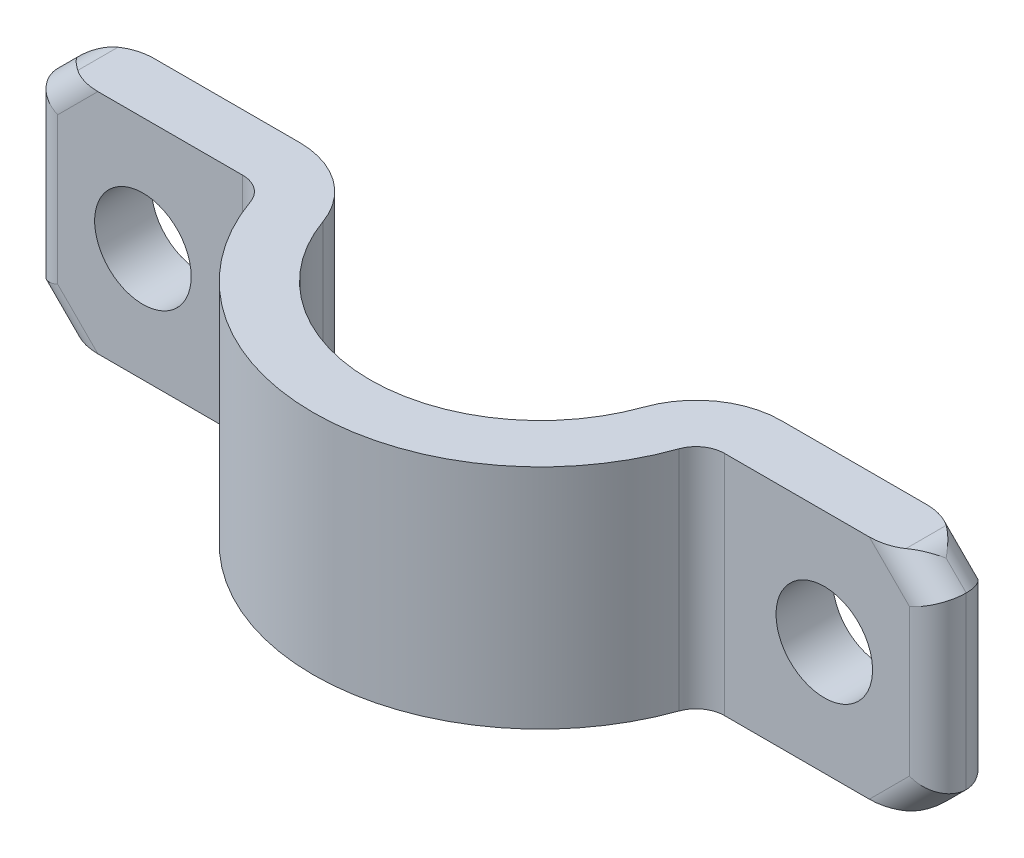
ISO-10303-21;
HEADER;
FILE_DESCRIPTION(('STEP AP214'),'2;1');
FILE_NAME('part.step','',(''),(''),'','','');
FILE_SCHEMA(('AUTOMOTIVE_DESIGN { 1 0 10303 214 1 1 1 1 }'));
ENDSEC;
DATA;
#1=APPLICATION_CONTEXT('core data for automotive mechanical design processes');
#2=APPLICATION_PROTOCOL_DEFINITION('international standard','automotive_design',2000,#1);
#3=PRODUCT_CONTEXT('',#1,'mechanical');
#4=PRODUCT('Part','Part','',(#3));
#5=PRODUCT_RELATED_PRODUCT_CATEGORY('part','',(#4));
#6=PRODUCT_DEFINITION_FORMATION('','',#4);
#7=PRODUCT_DEFINITION_CONTEXT('part definition',#1,'design');
#8=PRODUCT_DEFINITION('design','',#6,#7);
#9=PRODUCT_DEFINITION_SHAPE('','',#8);
#10=(LENGTH_UNIT() NAMED_UNIT(*) SI_UNIT(.MILLI.,.METRE.));
#11=(NAMED_UNIT(*) PLANE_ANGLE_UNIT() SI_UNIT($,.RADIAN.));
#12=(NAMED_UNIT(*) SI_UNIT($,.STERADIAN.) SOLID_ANGLE_UNIT());
#13=UNCERTAINTY_MEASURE_WITH_UNIT(LENGTH_MEASURE(1.E-05),#10,'distance_accuracy_value','');
#14=(GEOMETRIC_REPRESENTATION_CONTEXT(3) GLOBAL_UNCERTAINTY_ASSIGNED_CONTEXT((#13)) GLOBAL_UNIT_ASSIGNED_CONTEXT((#10,
#11,#12)) REPRESENTATION_CONTEXT('',''));
#15=CARTESIAN_POINT('',(0.,0.,0.));
#16=DIRECTION('',(0.,0.,1.));
#17=DIRECTION('',(1.,0.,0.));
#18=AXIS2_PLACEMENT_3D('',#15,#16,#17);
#19=CARTESIAN_POINT('',(-16.,8.,2.));
#20=DIRECTION('',(0.,0.,-1.));
#21=DIRECTION('',(-1.,0.,0.));
#22=AXIS2_PLACEMENT_3D('',#19,#20,#21);
#23=PLANE('',#22);
#24=CARTESIAN_POINT('',(-12.,4.,2.));
#25=DIRECTION('',(0.,0.,1.));
#26=DIRECTION('',(1.,0.,0.));
#27=AXIS2_PLACEMENT_3D('',#24,#25,#26);
#28=CIRCLE('',#27,1.7);
#29=CARTESIAN_POINT('',(-10.3,4.,2.));
#30=VERTEX_POINT('',#29);
#31=EDGE_CURVE('E170',#30,#30,#28,.T.);
#32=ORIENTED_EDGE('',*,*,#31,.F.);
#33=EDGE_LOOP('',(#32));
#34=FACE_BOUND('',#33,.T.);
#35=DIRECTION('',(0.,-1.,0.));
#36=VECTOR('',#35,1.);
#37=CARTESIAN_POINT('',(-15.,8.,2.));
#38=LINE('',#37,#36);
#39=CARTESIAN_POINT('',(-15.,6.58578643762691,2.));
#40=VERTEX_POINT('',#39);
#41=CARTESIAN_POINT('',(-15.,1.4142135623731,2.));
#42=VERTEX_POINT('',#41);
#43=EDGE_CURVE('E121',#40,#42,#38,.T.);
#44=ORIENTED_EDGE('',*,*,#43,.T.);
#45=DIRECTION('',(0.707106781186549,-0.707106781186546,0.));
#46=VECTOR('',#45,1.);
#47=CARTESIAN_POINT('',(-14.2928932188135,0.707106781186549,2.));
#48=LINE('',#47,#46);
#49=CARTESIAN_POINT('',(-13.5857864376269,0.,2.));
#50=VERTEX_POINT('',#49);
#51=EDGE_CURVE('E124',#42,#50,#48,.T.);
#52=ORIENTED_EDGE('',*,*,#51,.T.);
#53=DIRECTION('',(1.,0.,0.));
#54=VECTOR('',#53,1.);
#55=CARTESIAN_POINT('',(-16.,0.,2.));
#56=LINE('',#55,#54);
#57=CARTESIAN_POINT('',(-8.48528137423857,0.,2.));
#58=VERTEX_POINT('',#57);
#59=EDGE_CURVE('E80',#50,#58,#56,.T.);
#60=ORIENTED_EDGE('',*,*,#59,.T.);
#61=DIRECTION('',(0.,-1.,0.));
#62=VECTOR('',#61,1.);
#63=CARTESIAN_POINT('',(-8.48528137423857,8.,2.));
#64=LINE('',#63,#62);
#65=CARTESIAN_POINT('',(-8.48528137423857,8.,2.));
#66=VERTEX_POINT('',#65);
#67=EDGE_CURVE('E220',#66,#58,#64,.T.);
#68=ORIENTED_EDGE('',*,*,#67,.F.);
#69=DIRECTION('',(1.,0.,0.));
#70=VECTOR('',#69,1.);
#71=CARTESIAN_POINT('',(-16.,8.,2.));
#72=LINE('',#71,#70);
#73=CARTESIAN_POINT('',(-13.5857864376269,8.,2.));
#74=VERTEX_POINT('',#73);
#75=EDGE_CURVE('E180',#74,#66,#72,.T.);
#76=ORIENTED_EDGE('',*,*,#75,.F.);
#77=DIRECTION('',(0.707106781186546,0.707106781186549,0.));
#78=VECTOR('',#77,1.);
#79=CARTESIAN_POINT('',(-15.2928932188135,6.29289321881345,2.));
#80=LINE('',#79,#78);
#81=EDGE_CURVE('E127',#74,#40,#80,.F.);
#82=ORIENTED_EDGE('',*,*,#81,.T.);
#83=EDGE_LOOP('',(#44,#52,#60,#68,#76,#82));
#84=FACE_BOUND('',#83,.T.);
#85=ADVANCED_FACE('F32',(#34,#84),#23,.F.);
#86=CARTESIAN_POINT('',(-8.48528137423857,8.,3.));
#87=DIRECTION('',(0.,-1.,0.));
#88=DIRECTION('',(0.,0.,-1.));
#89=AXIS2_PLACEMENT_3D('',#86,#87,#88);
#90=CYLINDRICAL_SURFACE('',#89,1.);
#91=CARTESIAN_POINT('',(-8.48528137423857,0.,3.));
#92=DIRECTION('',(0.,-1.,0.));
#93=DIRECTION('',(0.,0.,-1.));
#94=AXIS2_PLACEMENT_3D('',#91,#92,#93);
#95=CIRCLE('',#94,1.);
#96=CARTESIAN_POINT('',(-7.54247233265651,0.,2.66666666666666));
#97=VERTEX_POINT('',#96);
#98=EDGE_CURVE('E201',#58,#97,#95,.T.);
#99=ORIENTED_EDGE('',*,*,#98,.T.);
#100=DIRECTION('',(0.,-1.,0.));
#101=VECTOR('',#100,1.);
#102=CARTESIAN_POINT('',(-7.54247233265651,8.,2.66666666666666));
#103=LINE('',#102,#101);
#104=CARTESIAN_POINT('',(-7.54247233265651,8.,2.66666666666666));
#105=VERTEX_POINT('',#104);
#106=EDGE_CURVE('E217',#105,#97,#103,.T.);
#107=ORIENTED_EDGE('',*,*,#106,.F.);
#108=CARTESIAN_POINT('',(-8.48528137423857,8.,3.));
#109=DIRECTION('',(0.,-1.,0.));
#110=DIRECTION('',(0.,0.,-1.));
#111=AXIS2_PLACEMENT_3D('',#108,#109,#110);
#112=CIRCLE('',#111,1.);
#113=EDGE_CURVE('E183',#66,#105,#112,.T.);
#114=ORIENTED_EDGE('',*,*,#113,.F.);
#115=ORIENTED_EDGE('',*,*,#67,.T.);
#116=EDGE_LOOP('',(#99,#107,#114,#115));
#117=FACE_BOUND('',#116,.T.);
#118=ADVANCED_FACE('F256',(#117),#90,.F.);
#119=CARTESIAN_POINT('',(0.,8.,0.));
#120=DIRECTION('',(0.,-1.,0.));
#121=DIRECTION('',(0.,0.,-1.));
#122=AXIS2_PLACEMENT_3D('',#119,#120,#121);
#123=CYLINDRICAL_SURFACE('',#122,8.);
#124=CARTESIAN_POINT('',(0.,0.,0.));
#125=DIRECTION('',(0.,1.,0.));
#126=DIRECTION('',(0.,0.,1.));
#127=AXIS2_PLACEMENT_3D('',#124,#125,#126);
#128=CIRCLE('',#127,8.);
#129=CARTESIAN_POINT('',(7.54247233265651,0.,2.66666666666666));
#130=VERTEX_POINT('',#129);
#131=EDGE_CURVE('E203',#97,#130,#128,.T.);
#132=ORIENTED_EDGE('',*,*,#131,.T.);
#133=DIRECTION('',(0.,-1.,0.));
#134=VECTOR('',#133,1.);
#135=CARTESIAN_POINT('',(7.54247233265651,8.,2.66666666666666));
#136=LINE('',#135,#134);
#137=CARTESIAN_POINT('',(7.54247233265651,8.,2.66666666666666));
#138=VERTEX_POINT('',#137);
#139=EDGE_CURVE('E266',#138,#130,#136,.T.);
#140=ORIENTED_EDGE('',*,*,#139,.F.);
#141=CARTESIAN_POINT('',(0.,8.,0.));
#142=DIRECTION('',(0.,1.,0.));
#143=DIRECTION('',(0.,0.,1.));
#144=AXIS2_PLACEMENT_3D('',#141,#142,#143);
#145=CIRCLE('',#144,8.);
#146=EDGE_CURVE('E187',#105,#138,#145,.T.);
#147=ORIENTED_EDGE('',*,*,#146,.F.);
#148=ORIENTED_EDGE('',*,*,#106,.T.);
#149=EDGE_LOOP('',(#132,#140,#147,#148));
#150=FACE_BOUND('',#149,.T.);
#151=ADVANCED_FACE('F261',(#150),#123,.T.);
#152=CARTESIAN_POINT('',(0.,8.,0.));
#153=DIRECTION('',(0.,-1.,0.));
#154=DIRECTION('',(0.,0.,-1.));
#155=AXIS2_PLACEMENT_3D('',#152,#153,#154);
#156=CYLINDRICAL_SURFACE('',#155,6.);
#157=CARTESIAN_POINT('',(0.,0.,0.));
#158=DIRECTION('',(0.,-1.,0.));
#159=DIRECTION('',(0.,0.,1.));
#160=AXIS2_PLACEMENT_3D('',#157,#158,#159);
#161=CIRCLE('',#160,6.);
#162=CARTESIAN_POINT('',(5.65685424949238,0.,1.99999999999999));
#163=VERTEX_POINT('',#162);
#164=CARTESIAN_POINT('',(-5.65685424949238,0.,2.));
#165=VERTEX_POINT('',#164);
#166=EDGE_CURVE('E206',#163,#165,#161,.T.);
#167=ORIENTED_EDGE('',*,*,#166,.T.);
#168=DIRECTION('',(0.,-1.,0.));
#169=VECTOR('',#168,1.);
#170=CARTESIAN_POINT('',(-5.65685424949238,8.,2.));
#171=LINE('',#170,#169);
#172=CARTESIAN_POINT('',(-5.65685424949238,8.,2.));
#173=VERTEX_POINT('',#172);
#174=EDGE_CURVE('E214',#173,#165,#171,.T.);
#175=ORIENTED_EDGE('',*,*,#174,.F.);
#176=CARTESIAN_POINT('',(0.,8.,0.));
#177=DIRECTION('',(0.,-1.,0.));
#178=DIRECTION('',(0.,0.,1.));
#179=AXIS2_PLACEMENT_3D('',#176,#177,#178);
#180=CIRCLE('',#179,6.);
#181=CARTESIAN_POINT('',(5.65685424949238,8.,1.99999999999999));
#182=VERTEX_POINT('',#181);
#183=EDGE_CURVE('E190',#182,#173,#180,.T.);
#184=ORIENTED_EDGE('',*,*,#183,.F.);
#185=DIRECTION('',(0.,-1.,0.));
#186=VECTOR('',#185,1.);
#187=CARTESIAN_POINT('',(5.65685424949238,8.,1.99999999999999));
#188=LINE('',#187,#186);
#189=EDGE_CURVE('E637',#182,#163,#188,.T.);
#190=ORIENTED_EDGE('',*,*,#189,.T.);
#191=EDGE_LOOP('',(#167,#175,#184,#190));
#192=FACE_BOUND('',#191,.T.);
#193=ADVANCED_FACE('F560',(#192),#156,.F.);
#194=CARTESIAN_POINT('',(-8.48528137423857,8.,3.));
#195=DIRECTION('',(0.,-1.,0.));
#196=DIRECTION('',(0.,0.,-1.));
#197=AXIS2_PLACEMENT_3D('',#194,#195,#196);
#198=CYLINDRICAL_SURFACE('',#197,3.);
#199=CARTESIAN_POINT('',(-8.48528137423857,0.,3.));
#200=DIRECTION('',(0.,1.,0.));
#201=DIRECTION('',(0.,0.,-1.));
#202=AXIS2_PLACEMENT_3D('',#199,#200,#201);
#203=CIRCLE('',#202,3.);
#204=CARTESIAN_POINT('',(-8.48528137423857,0.,0.));
#205=VERTEX_POINT('',#204);
#206=EDGE_CURVE('E208',#165,#205,#203,.T.);
#207=ORIENTED_EDGE('',*,*,#206,.T.);
#208=DIRECTION('',(0.,-1.,0.));
#209=VECTOR('',#208,1.);
#210=CARTESIAN_POINT('',(-8.48528137423857,8.,0.));
#211=LINE('',#210,#209);
#212=CARTESIAN_POINT('',(-8.48528137423857,8.,0.));
#213=VERTEX_POINT('',#212);
#214=EDGE_CURVE('E199',#213,#205,#211,.T.);
#215=ORIENTED_EDGE('',*,*,#214,.F.);
#216=CARTESIAN_POINT('',(-8.48528137423857,8.,3.));
#217=DIRECTION('',(0.,1.,0.));
#218=DIRECTION('',(0.,0.,-1.));
#219=AXIS2_PLACEMENT_3D('',#216,#217,#218);
#220=CIRCLE('',#219,3.);
#221=EDGE_CURVE('E193',#173,#213,#220,.T.);
#222=ORIENTED_EDGE('',*,*,#221,.F.);
#223=ORIENTED_EDGE('',*,*,#174,.T.);
#224=EDGE_LOOP('',(#207,#215,#222,#223));
#225=FACE_BOUND('',#224,.T.);
#226=ADVANCED_FACE('F348',(#225),#198,.T.);
#227=CARTESIAN_POINT('',(-16.,8.,0.));
#228=DIRECTION('',(0.,0.,1.));
#229=DIRECTION('',(1.,0.,0.));
#230=AXIS2_PLACEMENT_3D('',#227,#228,#229);
#231=PLANE('',#230);
#232=DIRECTION('',(-1.,0.,0.));
#233=VECTOR('',#232,1.);
#234=CARTESIAN_POINT('',(-16.,0.,0.));
#235=LINE('',#234,#233);
#236=CARTESIAN_POINT('',(-13.5857864376269,0.,0.));
#237=VERTEX_POINT('',#236);
#238=EDGE_CURVE('E184',#205,#237,#235,.T.);
#239=ORIENTED_EDGE('',*,*,#238,.T.);
#240=DIRECTION('',(-0.707106781186549,0.707106781186546,0.));
#241=VECTOR('',#240,1.);
#242=CARTESIAN_POINT('',(-15.2928932188135,1.70710678118655,0.));
#243=LINE('',#242,#241);
#244=CARTESIAN_POINT('',(-15.,1.41421356237309,0.));
#245=VERTEX_POINT('',#244);
#246=EDGE_CURVE('E129',#237,#245,#243,.T.);
#247=ORIENTED_EDGE('',*,*,#246,.T.);
#248=DIRECTION('',(0.,-1.,0.));
#249=VECTOR('',#248,1.);
#250=CARTESIAN_POINT('',(-15.,8.,0.));
#251=LINE('',#250,#249);
#252=CARTESIAN_POINT('',(-15.,6.58578643762691,0.));
#253=VERTEX_POINT('',#252);
#254=EDGE_CURVE('E228',#245,#253,#251,.F.);
#255=ORIENTED_EDGE('',*,*,#254,.T.);
#256=DIRECTION('',(-0.707106781186546,-0.707106781186549,0.));
#257=VECTOR('',#256,1.);
#258=CARTESIAN_POINT('',(-14.2928932188135,7.29289321881346,0.));
#259=LINE('',#258,#257);
#260=CARTESIAN_POINT('',(-13.5857864376269,8.,0.));
#261=VERTEX_POINT('',#260);
#262=EDGE_CURVE('E230',#253,#261,#259,.F.);
#263=ORIENTED_EDGE('',*,*,#262,.T.);
#264=DIRECTION('',(-1.,0.,0.));
#265=VECTOR('',#264,1.);
#266=CARTESIAN_POINT('',(-16.,8.,0.));
#267=LINE('',#266,#265);
#268=EDGE_CURVE('E196',#213,#261,#267,.T.);
#269=ORIENTED_EDGE('',*,*,#268,.F.);
#270=ORIENTED_EDGE('',*,*,#214,.T.);
#271=EDGE_LOOP('',(#239,#247,#255,#263,#269,#270));
#272=FACE_BOUND('',#271,.T.);
#273=CARTESIAN_POINT('',(-12.,4.,0.));
#274=DIRECTION('',(0.,0.,1.));
#275=DIRECTION('',(1.,0.,0.));
#276=AXIS2_PLACEMENT_3D('',#273,#274,#275);
#277=CIRCLE('',#276,1.7);
#278=CARTESIAN_POINT('',(-10.3,4.,0.));
#279=VERTEX_POINT('',#278);
#280=EDGE_CURVE('E172',#279,#279,#277,.T.);
#281=ORIENTED_EDGE('',*,*,#280,.T.);
#282=EDGE_LOOP('',(#281));
#283=FACE_BOUND('',#282,.T.);
#284=ADVANCED_FACE('F235',(#272,#283),#231,.F.);
#285=CARTESIAN_POINT('',(-8.48528137423857,8.,3.));
#286=DIRECTION('',(0.,-1.,0.));
#287=DIRECTION('',(0.,0.,-1.));
#288=AXIS2_PLACEMENT_3D('',#285,#286,#287);
#289=PLANE('',#288);
#290=ORIENTED_EDGE('',*,*,#268,.T.);
#291=CARTESIAN_POINT('',(-13.5857864376269,8.,1.));
#292=DIRECTION('',(0.,-1.,0.));
#293=DIRECTION('',(1.,0.,0.));
#294=AXIS2_PLACEMENT_3D('',#291,#292,#293);
#295=ELLIPSE('',#294,1.41421356237309,1.);
#296=CARTESIAN_POINT('',(-14.5857864376269,8.,0.292893218813449));
#297=VERTEX_POINT('',#296);
#298=EDGE_CURVE('E11',#261,#297,#295,.F.);
#299=ORIENTED_EDGE('',*,*,#298,.T.);
#300=DIRECTION('',(0.,0.,-1.));
#301=VECTOR('',#300,1.);
#302=CARTESIAN_POINT('',(-14.5857864376269,8.,2.));
#303=LINE('',#302,#301);
#304=CARTESIAN_POINT('',(-14.5857864376269,8.,1.70710678118655));
#305=VERTEX_POINT('',#304);
#306=EDGE_CURVE('E50',#297,#305,#303,.F.);
#307=ORIENTED_EDGE('',*,*,#306,.T.);
#308=CARTESIAN_POINT('',(-13.5857864376269,8.,1.));
#309=DIRECTION('',(0.,-1.,0.));
#310=DIRECTION('',(-1.,0.,0.));
#311=AXIS2_PLACEMENT_3D('',#308,#309,#310);
#312=ELLIPSE('',#311,1.41421356237309,1.);
#313=EDGE_CURVE('E42',#305,#74,#312,.F.);
#314=ORIENTED_EDGE('',*,*,#313,.T.);
#315=ORIENTED_EDGE('',*,*,#75,.T.);
#316=ORIENTED_EDGE('',*,*,#113,.T.);
#317=ORIENTED_EDGE('',*,*,#146,.T.);
#318=CARTESIAN_POINT('',(8.48528137423857,8.,2.99999999999999));
#319=DIRECTION('',(0.,1.,0.));
#320=DIRECTION('',(0.,0.,-1.));
#321=AXIS2_PLACEMENT_3D('',#318,#319,#320);
#322=CIRCLE('',#321,1.);
#323=CARTESIAN_POINT('',(8.48528137423857,8.,1.99999999999999));
#324=VERTEX_POINT('',#323);
#325=EDGE_CURVE('E274',#324,#138,#322,.T.);
#326=ORIENTED_EDGE('',*,*,#325,.F.);
#327=DIRECTION('',(-1.,0.,0.));
#328=VECTOR('',#327,1.);
#329=CARTESIAN_POINT('',(16.,8.,1.99999999999998));
#330=LINE('',#329,#328);
#331=CARTESIAN_POINT('',(13.5857864376269,8.,1.99999999999999));
#332=VERTEX_POINT('',#331);
#333=EDGE_CURVE('E649',#332,#324,#330,.T.);
#334=ORIENTED_EDGE('',*,*,#333,.F.);
#335=CARTESIAN_POINT('',(13.5857864376269,8.,0.999999999999987));
#336=DIRECTION('',(0.,1.,0.));
#337=DIRECTION('',(1.,0.,0.));
#338=AXIS2_PLACEMENT_3D('',#335,#336,#337);
#339=ELLIPSE('',#338,1.41421356237309,1.);
#340=CARTESIAN_POINT('',(14.5857864376269,8.,1.70710678118653));
#341=VERTEX_POINT('',#340);
#342=EDGE_CURVE('E691',#341,#332,#339,.F.);
#343=ORIENTED_EDGE('',*,*,#342,.F.);
#344=DIRECTION('',(0.,0.,-1.));
#345=VECTOR('',#344,1.);
#346=CARTESIAN_POINT('',(14.5857864376269,8.,1.99999999999999));
#347=LINE('',#346,#345);
#348=CARTESIAN_POINT('',(14.5857864376269,8.,0.292893218813435));
#349=VERTEX_POINT('',#348);
#350=EDGE_CURVE('E688',#349,#341,#347,.F.);
#351=ORIENTED_EDGE('',*,*,#350,.F.);
#352=CARTESIAN_POINT('',(13.5857864376269,8.,0.999999999999987));
#353=DIRECTION('',(0.,1.,0.));
#354=DIRECTION('',(-1.,0.,0.));
#355=AXIS2_PLACEMENT_3D('',#352,#353,#354);
#356=ELLIPSE('',#355,1.41421356237309,1.);
#357=CARTESIAN_POINT('',(13.5857864376269,8.,0.));
#358=VERTEX_POINT('',#357);
#359=EDGE_CURVE('E152',#358,#349,#356,.F.);
#360=ORIENTED_EDGE('',*,*,#359,.F.);
#361=DIRECTION('',(1.,0.,0.));
#362=VECTOR('',#361,1.);
#363=CARTESIAN_POINT('',(16.,8.,0.));
#364=LINE('',#363,#362);
#365=CARTESIAN_POINT('',(8.48528137423857,8.,0.));
#366=VERTEX_POINT('',#365);
#367=EDGE_CURVE('E656',#366,#358,#364,.T.);
#368=ORIENTED_EDGE('',*,*,#367,.F.);
#369=CARTESIAN_POINT('',(8.48528137423857,8.,2.99999999999999));
#370=DIRECTION('',(0.,-1.,0.));
#371=DIRECTION('',(0.,0.,-1.));
#372=AXIS2_PLACEMENT_3D('',#369,#370,#371);
#373=CIRCLE('',#372,3.);
#374=EDGE_CURVE('E730',#182,#366,#373,.T.);
#375=ORIENTED_EDGE('',*,*,#374,.F.);
#376=ORIENTED_EDGE('',*,*,#183,.T.);
#377=ORIENTED_EDGE('',*,*,#221,.T.);
#378=EDGE_LOOP('',(#290,#299,#307,#314,#315,#316,#317,#326,#334,#343,#351,#360,#368,#375,#376,#377));
#379=FACE_BOUND('',#378,.T.);
#380=ADVANCED_FACE('F271',(#379),#289,.F.);
#381=CARTESIAN_POINT('',(-8.48528137423857,0.,3.));
#382=DIRECTION('',(0.,-1.,0.));
#383=DIRECTION('',(0.,0.,-1.));
#384=AXIS2_PLACEMENT_3D('',#381,#382,#383);
#385=PLANE('',#384);
#386=DIRECTION('',(0.,0.,-1.));
#387=VECTOR('',#386,1.);
#388=CARTESIAN_POINT('',(-14.5857864376269,0.,2.99999999999999));
#389=LINE('',#388,#387);
#390=CARTESIAN_POINT('',(-14.5857864376269,0.,1.70710678118654));
#391=VERTEX_POINT('',#390);
#392=CARTESIAN_POINT('',(-14.5857864376269,0.,0.292893218813452));
#393=VERTEX_POINT('',#392);
#394=EDGE_CURVE('E223',#391,#393,#389,.T.);
#395=ORIENTED_EDGE('',*,*,#394,.T.);
#396=CARTESIAN_POINT('',(-13.5857864376269,0.,1.));
#397=DIRECTION('',(0.,-1.,0.));
#398=DIRECTION('',(1.,0.,0.));
#399=AXIS2_PLACEMENT_3D('',#396,#397,#398);
#400=ELLIPSE('',#399,1.4142135623731,1.);
#401=EDGE_CURVE('E226',#393,#237,#400,.T.);
#402=ORIENTED_EDGE('',*,*,#401,.T.);
#403=ORIENTED_EDGE('',*,*,#238,.F.);
#404=ORIENTED_EDGE('',*,*,#206,.F.);
#405=ORIENTED_EDGE('',*,*,#166,.F.);
#406=CARTESIAN_POINT('',(8.48528137423857,0.,2.99999999999999));
#407=DIRECTION('',(0.,-1.,0.));
#408=DIRECTION('',(0.,0.,-1.));
#409=AXIS2_PLACEMENT_3D('',#406,#407,#408);
#410=CIRCLE('',#409,3.);
#411=CARTESIAN_POINT('',(8.48528137423857,0.,0.));
#412=VERTEX_POINT('',#411);
#413=EDGE_CURVE('E641',#163,#412,#410,.T.);
#414=ORIENTED_EDGE('',*,*,#413,.T.);
#415=DIRECTION('',(1.,0.,0.));
#416=VECTOR('',#415,1.);
#417=CARTESIAN_POINT('',(16.,0.,0.));
#418=LINE('',#417,#416);
#419=CARTESIAN_POINT('',(13.5857864376269,0.,0.));
#420=VERTEX_POINT('',#419);
#421=EDGE_CURVE('E646',#412,#420,#418,.T.);
#422=ORIENTED_EDGE('',*,*,#421,.T.);
#423=CARTESIAN_POINT('',(13.5857864376269,0.,0.999999999999987));
#424=DIRECTION('',(0.,1.,0.));
#425=DIRECTION('',(-1.,0.,0.));
#426=AXIS2_PLACEMENT_3D('',#423,#424,#425);
#427=ELLIPSE('',#426,1.4142135623731,1.);
#428=CARTESIAN_POINT('',(14.5857864376269,0.,0.292893218813438));
#429=VERTEX_POINT('',#428);
#430=EDGE_CURVE('E668',#429,#420,#427,.T.);
#431=ORIENTED_EDGE('',*,*,#430,.F.);
#432=DIRECTION('',(0.,0.,-1.));
#433=VECTOR('',#432,1.);
#434=CARTESIAN_POINT('',(14.5857864376269,0.,2.99999999999998));
#435=LINE('',#434,#433);
#436=CARTESIAN_POINT('',(14.5857864376269,0.,1.70710678118653));
#437=VERTEX_POINT('',#436);
#438=EDGE_CURVE('E665',#437,#429,#435,.T.);
#439=ORIENTED_EDGE('',*,*,#438,.F.);
#440=CARTESIAN_POINT('',(13.5857864376269,0.,0.999999999999987));
#441=DIRECTION('',(0.,1.,0.));
#442=DIRECTION('',(1.,0.,0.));
#443=AXIS2_PLACEMENT_3D('',#440,#441,#442);
#444=ELLIPSE('',#443,1.4142135623731,1.);
#445=CARTESIAN_POINT('',(13.5857864376269,0.,1.99999999999999));
#446=VERTEX_POINT('',#445);
#447=EDGE_CURVE('E662',#446,#437,#444,.T.);
#448=ORIENTED_EDGE('',*,*,#447,.F.);
#449=DIRECTION('',(-1.,0.,0.));
#450=VECTOR('',#449,1.);
#451=CARTESIAN_POINT('',(16.,0.,1.99999999999998));
#452=LINE('',#451,#450);
#453=CARTESIAN_POINT('',(8.48528137423857,0.,1.99999999999999));
#454=VERTEX_POINT('',#453);
#455=EDGE_CURVE('E651',#446,#454,#452,.T.);
#456=ORIENTED_EDGE('',*,*,#455,.T.);
#457=CARTESIAN_POINT('',(8.48528137423857,0.,2.99999999999999));
#458=DIRECTION('',(0.,1.,0.));
#459=DIRECTION('',(0.,0.,-1.));
#460=AXIS2_PLACEMENT_3D('',#457,#458,#459);
#461=CIRCLE('',#460,1.);
#462=EDGE_CURVE('E647',#454,#130,#461,.T.);
#463=ORIENTED_EDGE('',*,*,#462,.T.);
#464=ORIENTED_EDGE('',*,*,#131,.F.);
#465=ORIENTED_EDGE('',*,*,#98,.F.);
#466=ORIENTED_EDGE('',*,*,#59,.F.);
#467=CARTESIAN_POINT('',(-13.5857864376269,0.,1.));
#468=DIRECTION('',(0.,-1.,0.));
#469=DIRECTION('',(-1.,0.,0.));
#470=AXIS2_PLACEMENT_3D('',#467,#468,#469);
#471=ELLIPSE('',#470,1.4142135623731,1.);
#472=EDGE_CURVE('E143',#50,#391,#471,.T.);
#473=ORIENTED_EDGE('',*,*,#472,.T.);
#474=EDGE_LOOP('',(#395,#402,#403,#404,#405,#414,#422,#431,#439,#448,#456,#463,#464,#465,#466,#473));
#475=FACE_BOUND('',#474,.T.);
#476=ADVANCED_FACE('F250',(#475),#385,.T.);
#477=CARTESIAN_POINT('',(-12.,4.,0.));
#478=DIRECTION('',(0.,0.,1.));
#479=DIRECTION('',(1.,0.,0.));
#480=AXIS2_PLACEMENT_3D('',#477,#478,#479);
#481=CYLINDRICAL_SURFACE('',#480,1.7);
#482=ORIENTED_EDGE('',*,*,#280,.F.);
#483=EDGE_LOOP('',(#482));
#484=FACE_BOUND('',#483,.T.);
#485=ORIENTED_EDGE('',*,*,#31,.T.);
#486=EDGE_LOOP('',(#485));
#487=FACE_BOUND('',#486,.T.);
#488=ADVANCED_FACE('F359',(#484,#487),#481,.F.);
#489=CARTESIAN_POINT('',(-14.5857864376269,7.,2.99999999999999));
#490=DIRECTION('',(0.,0.,1.));
#491=DIRECTION('',(1.,0.,0.));
#492=AXIS2_PLACEMENT_3D('',#489,#490,#491);
#493=CYLINDRICAL_SURFACE('',#492,1.);
#494=CARTESIAN_POINT('',(-14.5857864376269,7.,1.));
#495=DIRECTION('',(-0.5,-0.500000000000001,0.707106781186547));
#496=DIRECTION('',(0.499999999999998,0.500000000000001,0.707106781186548));
#497=AXIS2_PLACEMENT_3D('',#494,#495,#496);
#498=ELLIPSE('',#497,1.41421356237309,1.);
#499=CARTESIAN_POINT('',(-15.2928932188135,7.70710678118655,0.999999999999999));
#500=VERTEX_POINT('',#499);
#501=EDGE_CURVE('E36',#305,#500,#498,.T.);
#502=ORIENTED_EDGE('',*,*,#501,.F.);
#503=ORIENTED_EDGE('',*,*,#306,.F.);
#504=CARTESIAN_POINT('',(-14.5857864376269,7.,1.));
#505=DIRECTION('',(0.499999999999998,0.500000000000001,0.707106781186548));
#506=DIRECTION('',(-0.5,-0.500000000000001,0.707106781186547));
#507=AXIS2_PLACEMENT_3D('',#504,#505,#506);
#508=ELLIPSE('',#507,1.4142135623731,1.);
#509=EDGE_CURVE('E166',#500,#297,#508,.F.);
#510=ORIENTED_EDGE('',*,*,#509,.F.);
#511=EDGE_LOOP('',(#502,#503,#510));
#512=FACE_BOUND('',#511,.T.);
#513=ADVANCED_FACE('F34',(#512),#493,.T.);
#514=CARTESIAN_POINT('',(-14.7928932188135,6.79289321881345,1.));
#515=DIRECTION('',(-0.707106781186546,-0.707106781186549,0.));
#516=DIRECTION('',(0.707106781186549,-0.707106781186546,0.));
#517=AXIS2_PLACEMENT_3D('',#514,#515,#516);
#518=CYLINDRICAL_SURFACE('',#517,1.);
#519=ORIENTED_EDGE('',*,*,#313,.F.);
#520=ORIENTED_EDGE('',*,*,#501,.T.);
#521=DIRECTION('',(-0.707106781186546,-0.707106781186549,0.));
#522=VECTOR('',#521,1.);
#523=CARTESIAN_POINT('',(-15.,8.,0.999999999999999));
#524=LINE('',#523,#522);
#525=CARTESIAN_POINT('',(-16.,7.,0.999999999999998));
#526=VERTEX_POINT('',#525);
#527=EDGE_CURVE('E68',#526,#500,#524,.F.);
#528=ORIENTED_EDGE('',*,*,#527,.F.);
#529=CARTESIAN_POINT('',(-15.,6.58578643762691,1.));
#530=DIRECTION('',(-0.382683432365089,-0.923879532511287,0.));
#531=DIRECTION('',(0.923879532511287,-0.382683432365089,0.));
#532=AXIS2_PLACEMENT_3D('',#529,#530,#531);
#533=ELLIPSE('',#532,1.08239220029239,1.);
#534=EDGE_CURVE('E164',#40,#526,#533,.T.);
#535=ORIENTED_EDGE('',*,*,#534,.F.);
#536=ORIENTED_EDGE('',*,*,#81,.F.);
#537=EDGE_LOOP('',(#519,#520,#528,#535,#536));
#538=FACE_BOUND('',#537,.T.);
#539=ADVANCED_FACE('F352',(#538),#518,.T.);
#540=CARTESIAN_POINT('',(-14.7928932188135,6.79289321881346,1.));
#541=DIRECTION('',(0.707106781186546,0.707106781186549,0.));
#542=DIRECTION('',(-0.707106781186549,0.707106781186546,0.));
#543=AXIS2_PLACEMENT_3D('',#540,#541,#542);
#544=CYLINDRICAL_SURFACE('',#543,1.);
#545=ORIENTED_EDGE('',*,*,#298,.F.);
#546=ORIENTED_EDGE('',*,*,#262,.F.);
#547=CARTESIAN_POINT('',(-15.,6.58578643762691,1.));
#548=DIRECTION('',(-0.382683432365089,-0.923879532511287,0.));
#549=DIRECTION('',(0.923879532511287,-0.382683432365089,0.));
#550=AXIS2_PLACEMENT_3D('',#547,#548,#549);
#551=ELLIPSE('',#550,1.08239220029239,1.);
#552=EDGE_CURVE('E161',#526,#253,#551,.T.);
#553=ORIENTED_EDGE('',*,*,#552,.F.);
#554=ORIENTED_EDGE('',*,*,#527,.T.);
#555=ORIENTED_EDGE('',*,*,#509,.T.);
#556=EDGE_LOOP('',(#545,#546,#553,#554,#555));
#557=FACE_BOUND('',#556,.T.);
#558=ADVANCED_FACE('F350',(#557),#544,.T.);
#559=CARTESIAN_POINT('',(-15.,8.,1.));
#560=DIRECTION('',(0.,-1.,0.));
#561=DIRECTION('',(0.,0.,-1.));
#562=AXIS2_PLACEMENT_3D('',#559,#560,#561);
#563=CYLINDRICAL_SURFACE('',#562,1.);
#564=ORIENTED_EDGE('',*,*,#43,.F.);
#565=ORIENTED_EDGE('',*,*,#534,.T.);
#566=DIRECTION('',(0.,-1.,0.));
#567=VECTOR('',#566,1.);
#568=CARTESIAN_POINT('',(-16.,8.,0.999999999999998));
#569=LINE('',#568,#567);
#570=CARTESIAN_POINT('',(-16.,1.,0.999999999999999));
#571=VERTEX_POINT('',#570);
#572=EDGE_CURVE('E135',#571,#526,#569,.F.);
#573=ORIENTED_EDGE('',*,*,#572,.F.);
#574=CARTESIAN_POINT('',(-15.,1.4142135623731,1.));
#575=DIRECTION('',(0.382683432365091,-0.923879532511287,0.));
#576=DIRECTION('',(-0.923879532511287,-0.382683432365091,0.));
#577=AXIS2_PLACEMENT_3D('',#574,#575,#576);
#578=ELLIPSE('',#577,1.08239220029239,1.);
#579=EDGE_CURVE('E132',#42,#571,#578,.T.);
#580=ORIENTED_EDGE('',*,*,#579,.F.);
#581=EDGE_LOOP('',(#564,#565,#573,#580));
#582=FACE_BOUND('',#581,.T.);
#583=ADVANCED_FACE('F133',(#582),#563,.T.);
#584=CARTESIAN_POINT('',(-15.,8.,1.));
#585=DIRECTION('',(0.,-1.,0.));
#586=DIRECTION('',(0.,0.,-1.));
#587=AXIS2_PLACEMENT_3D('',#584,#585,#586);
#588=CYLINDRICAL_SURFACE('',#587,1.);
#589=ORIENTED_EDGE('',*,*,#552,.T.);
#590=ORIENTED_EDGE('',*,*,#254,.F.);
#591=CARTESIAN_POINT('',(-15.,1.4142135623731,1.));
#592=DIRECTION('',(0.382683432365091,-0.923879532511287,0.));
#593=DIRECTION('',(-0.923879532511287,-0.382683432365091,0.));
#594=AXIS2_PLACEMENT_3D('',#591,#592,#593);
#595=ELLIPSE('',#594,1.08239220029239,1.);
#596=EDGE_CURVE('E138',#571,#245,#595,.T.);
#597=ORIENTED_EDGE('',*,*,#596,.F.);
#598=ORIENTED_EDGE('',*,*,#572,.T.);
#599=EDGE_LOOP('',(#589,#590,#597,#598));
#600=FACE_BOUND('',#599,.T.);
#601=ADVANCED_FACE('F242',(#600),#588,.T.);
#602=CARTESIAN_POINT('',(-18.7928932188135,5.20710678118654,1.));
#603=DIRECTION('',(-0.707106781186549,0.707106781186546,0.));
#604=DIRECTION('',(-0.707106781186546,-0.707106781186549,0.));
#605=AXIS2_PLACEMENT_3D('',#602,#603,#604);
#606=CYLINDRICAL_SURFACE('',#605,1.);
#607=ORIENTED_EDGE('',*,*,#51,.F.);
#608=ORIENTED_EDGE('',*,*,#579,.T.);
#609=DIRECTION('',(0.707106781186549,-0.707106781186546,0.));
#610=VECTOR('',#609,1.);
#611=CARTESIAN_POINT('',(-16.,1.,0.999999999999999));
#612=LINE('',#611,#610);
#613=CARTESIAN_POINT('',(-15.2928932188135,0.292893218813451,0.999999999999999));
#614=VERTEX_POINT('',#613);
#615=EDGE_CURVE('E155',#614,#571,#612,.F.);
#616=ORIENTED_EDGE('',*,*,#615,.F.);
#617=CARTESIAN_POINT('',(-14.5857864376269,1.,1.));
#618=DIRECTION('',(-0.500000000000002,0.499999999999999,0.707106781186547));
#619=DIRECTION('',(-0.5,0.499999999999999,-0.707106781186548));
#620=AXIS2_PLACEMENT_3D('',#617,#618,#619);
#621=ELLIPSE('',#620,1.41421356237309,1.);
#622=EDGE_CURVE('E151',#391,#614,#621,.F.);
#623=ORIENTED_EDGE('',*,*,#622,.F.);
#624=ORIENTED_EDGE('',*,*,#472,.F.);
#625=EDGE_LOOP('',(#607,#608,#616,#623,#624));
#626=FACE_BOUND('',#625,.T.);
#627=ADVANCED_FACE('F141',(#626),#606,.T.);
#628=CARTESIAN_POINT('',(-18.7928932188135,5.20710678118654,1.));
#629=DIRECTION('',(0.707106781186549,-0.707106781186546,0.));
#630=DIRECTION('',(0.707106781186546,0.707106781186549,0.));
#631=AXIS2_PLACEMENT_3D('',#628,#629,#630);
#632=CYLINDRICAL_SURFACE('',#631,1.);
#633=ORIENTED_EDGE('',*,*,#246,.F.);
#634=ORIENTED_EDGE('',*,*,#401,.F.);
#635=CARTESIAN_POINT('',(-14.5857864376269,1.,1.));
#636=DIRECTION('',(0.5,-0.499999999999999,0.707106781186548));
#637=DIRECTION('',(0.500000000000002,-0.499999999999999,-0.707106781186547));
#638=AXIS2_PLACEMENT_3D('',#635,#636,#637);
#639=ELLIPSE('',#638,1.4142135623731,1.);
#640=EDGE_CURVE('E149',#614,#393,#639,.T.);
#641=ORIENTED_EDGE('',*,*,#640,.F.);
#642=ORIENTED_EDGE('',*,*,#615,.T.);
#643=ORIENTED_EDGE('',*,*,#596,.T.);
#644=EDGE_LOOP('',(#633,#634,#641,#642,#643));
#645=FACE_BOUND('',#644,.T.);
#646=ADVANCED_FACE('F244',(#645),#632,.T.);
#647=CARTESIAN_POINT('',(-14.5857864376269,1.,2.99999999999999));
#648=DIRECTION('',(0.,0.,-1.));
#649=DIRECTION('',(-1.,0.,0.));
#650=AXIS2_PLACEMENT_3D('',#647,#648,#649);
#651=CYLINDRICAL_SURFACE('',#650,1.);
#652=ORIENTED_EDGE('',*,*,#394,.F.);
#653=ORIENTED_EDGE('',*,*,#622,.T.);
#654=ORIENTED_EDGE('',*,*,#640,.T.);
#655=EDGE_LOOP('',(#652,#653,#654));
#656=FACE_BOUND('',#655,.T.);
#657=ADVANCED_FACE('F248',(#656),#651,.T.);
#658=CARTESIAN_POINT('',(16.,8.,1.99999999999998));
#659=DIRECTION('',(0.,0.,-1.));
#660=DIRECTION('',(1.,0.,0.));
#661=AXIS2_PLACEMENT_3D('',#658,#659,#660);
#662=PLANE('',#661);
#663=CARTESIAN_POINT('',(12.,4.,1.99999999999999));
#664=DIRECTION('',(0.,0.,-1.));
#665=DIRECTION('',(-1.,0.,0.));
#666=AXIS2_PLACEMENT_3D('',#663,#664,#665);
#667=CIRCLE('',#666,1.7);
#668=CARTESIAN_POINT('',(10.3,4.,1.99999999999999));
#669=VERTEX_POINT('',#668);
#670=EDGE_CURVE('E719',#669,#669,#667,.T.);
#671=ORIENTED_EDGE('',*,*,#670,.T.);
#672=EDGE_LOOP('',(#671));
#673=FACE_BOUND('',#672,.T.);
#674=DIRECTION('',(0.,-1.,0.));
#675=VECTOR('',#674,1.);
#676=CARTESIAN_POINT('',(15.,8.,1.99999999999999));
#677=LINE('',#676,#675);
#678=CARTESIAN_POINT('',(15.,6.58578643762691,1.99999999999999));
#679=VERTEX_POINT('',#678);
#680=CARTESIAN_POINT('',(15.,1.4142135623731,1.99999999999999));
#681=VERTEX_POINT('',#680);
#682=EDGE_CURVE('E679',#679,#681,#677,.T.);
#683=ORIENTED_EDGE('',*,*,#682,.F.);
#684=DIRECTION('',(-0.707106781186546,0.707106781186549,0.));
#685=VECTOR('',#684,1.);
#686=CARTESIAN_POINT('',(15.2928932188135,6.29289321881345,1.99999999999998));
#687=LINE('',#686,#685);
#688=EDGE_CURVE('E682',#332,#679,#687,.F.);
#689=ORIENTED_EDGE('',*,*,#688,.F.);
#690=ORIENTED_EDGE('',*,*,#333,.T.);
#691=DIRECTION('',(0.,-1.,0.));
#692=VECTOR('',#691,1.);
#693=CARTESIAN_POINT('',(8.48528137423857,8.,1.99999999999999));
#694=LINE('',#693,#692);
#695=EDGE_CURVE('E659',#324,#454,#694,.T.);
#696=ORIENTED_EDGE('',*,*,#695,.T.);
#697=ORIENTED_EDGE('',*,*,#455,.F.);
#698=DIRECTION('',(-0.707106781186549,-0.707106781186546,0.));
#699=VECTOR('',#698,1.);
#700=CARTESIAN_POINT('',(14.2928932188135,0.707106781186549,1.99999999999999));
#701=LINE('',#700,#699);
#702=EDGE_CURVE('E685',#681,#446,#701,.T.);
#703=ORIENTED_EDGE('',*,*,#702,.F.);
#704=EDGE_LOOP('',(#683,#689,#690,#696,#697,#703));
#705=FACE_BOUND('',#704,.T.);
#706=ADVANCED_FACE('F371',(#673,#705),#662,.F.);
#707=CARTESIAN_POINT('',(8.48528137423857,8.,2.99999999999999));
#708=DIRECTION('',(0.,-1.,0.));
#709=DIRECTION('',(0.,0.,-1.));
#710=AXIS2_PLACEMENT_3D('',#707,#708,#709);
#711=CYLINDRICAL_SURFACE('',#710,1.);
#712=ORIENTED_EDGE('',*,*,#462,.F.);
#713=ORIENTED_EDGE('',*,*,#695,.F.);
#714=ORIENTED_EDGE('',*,*,#325,.T.);
#715=ORIENTED_EDGE('',*,*,#139,.T.);
#716=EDGE_LOOP('',(#712,#713,#714,#715));
#717=FACE_BOUND('',#716,.T.);
#718=ADVANCED_FACE('F412',(#717),#711,.F.);
#719=CARTESIAN_POINT('',(8.48528137423857,8.,2.99999999999999));
#720=DIRECTION('',(0.,-1.,0.));
#721=DIRECTION('',(0.,0.,-1.));
#722=AXIS2_PLACEMENT_3D('',#719,#720,#721);
#723=CYLINDRICAL_SURFACE('',#722,3.);
#724=ORIENTED_EDGE('',*,*,#413,.F.);
#725=ORIENTED_EDGE('',*,*,#189,.F.);
#726=ORIENTED_EDGE('',*,*,#374,.T.);
#727=DIRECTION('',(0.,-1.,0.));
#728=VECTOR('',#727,1.);
#729=CARTESIAN_POINT('',(8.48528137423857,8.,0.));
#730=LINE('',#729,#728);
#731=EDGE_CURVE('E645',#366,#412,#730,.T.);
#732=ORIENTED_EDGE('',*,*,#731,.T.);
#733=EDGE_LOOP('',(#724,#725,#726,#732));
#734=FACE_BOUND('',#733,.T.);
#735=ADVANCED_FACE('F421',(#734),#723,.T.);
#736=CARTESIAN_POINT('',(16.,8.,0.));
#737=DIRECTION('',(0.,0.,1.));
#738=DIRECTION('',(-1.,0.,0.));
#739=AXIS2_PLACEMENT_3D('',#736,#737,#738);
#740=PLANE('',#739);
#741=ORIENTED_EDGE('',*,*,#421,.F.);
#742=ORIENTED_EDGE('',*,*,#731,.F.);
#743=ORIENTED_EDGE('',*,*,#367,.T.);
#744=DIRECTION('',(0.707106781186546,-0.707106781186549,0.));
#745=VECTOR('',#744,1.);
#746=CARTESIAN_POINT('',(14.2928932188135,7.29289321881346,0.));
#747=LINE('',#746,#745);
#748=CARTESIAN_POINT('',(15.,6.58578643762691,0.));
#749=VERTEX_POINT('',#748);
#750=EDGE_CURVE('E673',#749,#358,#747,.F.);
#751=ORIENTED_EDGE('',*,*,#750,.F.);
#752=DIRECTION('',(0.,-1.,0.));
#753=VECTOR('',#752,1.);
#754=CARTESIAN_POINT('',(15.,8.,0.));
#755=LINE('',#754,#753);
#756=CARTESIAN_POINT('',(15.,1.41421356237309,0.));
#757=VERTEX_POINT('',#756);
#758=EDGE_CURVE('E670',#757,#749,#755,.F.);
#759=ORIENTED_EDGE('',*,*,#758,.F.);
#760=DIRECTION('',(0.707106781186549,0.707106781186546,0.));
#761=VECTOR('',#760,1.);
#762=CARTESIAN_POINT('',(15.2928932188135,1.70710678118655,0.));
#763=LINE('',#762,#761);
#764=EDGE_CURVE('E676',#420,#757,#763,.T.);
#765=ORIENTED_EDGE('',*,*,#764,.F.);
#766=EDGE_LOOP('',(#741,#742,#743,#751,#759,#765));
#767=FACE_BOUND('',#766,.T.);
#768=CARTESIAN_POINT('',(12.,4.,0.));
#769=DIRECTION('',(0.,0.,-1.));
#770=DIRECTION('',(-1.,0.,0.));
#771=AXIS2_PLACEMENT_3D('',#768,#769,#770);
#772=CIRCLE('',#771,1.7);
#773=CARTESIAN_POINT('',(10.3,4.,0.));
#774=VERTEX_POINT('',#773);
#775=EDGE_CURVE('E721',#774,#774,#772,.T.);
#776=ORIENTED_EDGE('',*,*,#775,.F.);
#777=EDGE_LOOP('',(#776));
#778=FACE_BOUND('',#777,.T.);
#779=ADVANCED_FACE('F429',(#767,#778),#740,.F.);
#780=CARTESIAN_POINT('',(12.,4.,0.));
#781=DIRECTION('',(0.,0.,1.));
#782=DIRECTION('',(-1.,0.,0.));
#783=AXIS2_PLACEMENT_3D('',#780,#781,#782);
#784=CYLINDRICAL_SURFACE('',#783,1.7);
#785=ORIENTED_EDGE('',*,*,#775,.T.);
#786=EDGE_LOOP('',(#785));
#787=FACE_BOUND('',#786,.T.);
#788=ORIENTED_EDGE('',*,*,#670,.F.);
#789=EDGE_LOOP('',(#788));
#790=FACE_BOUND('',#789,.T.);
#791=ADVANCED_FACE('F437',(#787,#790),#784,.F.);
#792=CARTESIAN_POINT('',(14.5857864376269,7.,2.99999999999998));
#793=DIRECTION('',(0.,0.,1.));
#794=DIRECTION('',(-1.,0.,0.));
#795=AXIS2_PLACEMENT_3D('',#792,#793,#794);
#796=CYLINDRICAL_SURFACE('',#795,1.);
#797=CARTESIAN_POINT('',(14.5857864376269,7.,0.999999999999986));
#798=DIRECTION('',(-0.500000000000001,0.500000000000001,-0.707106781186547));
#799=DIRECTION('',(-0.499999999999997,0.500000000000001,0.707106781186548));
#800=AXIS2_PLACEMENT_3D('',#797,#798,#799);
#801=ELLIPSE('',#800,1.41421356237309,1.);
#802=CARTESIAN_POINT('',(15.2928932188135,7.70710678118655,0.999999999999984));
#803=VERTEX_POINT('',#802);
#804=EDGE_CURVE('E717',#341,#803,#801,.T.);
#805=ORIENTED_EDGE('',*,*,#804,.T.);
#806=CARTESIAN_POINT('',(14.5857864376269,7.,0.999999999999986));
#807=DIRECTION('',(0.499999999999997,-0.500000000000001,-0.707106781186548));
#808=DIRECTION('',(0.500000000000001,-0.500000000000001,0.707106781186547));
#809=AXIS2_PLACEMENT_3D('',#806,#807,#808);
#810=ELLIPSE('',#809,1.4142135623731,1.);
#811=EDGE_CURVE('E716',#803,#349,#810,.F.);
#812=ORIENTED_EDGE('',*,*,#811,.T.);
#813=ORIENTED_EDGE('',*,*,#350,.T.);
#814=EDGE_LOOP('',(#805,#812,#813));
#815=FACE_BOUND('',#814,.T.);
#816=ADVANCED_FACE('F445',(#815),#796,.T.);
#817=CARTESIAN_POINT('',(14.7928932188135,6.79289321881345,0.999999999999985));
#818=DIRECTION('',(0.707106781186546,-0.707106781186549,0.));
#819=DIRECTION('',(-0.707106781186549,-0.707106781186546,0.));
#820=AXIS2_PLACEMENT_3D('',#817,#818,#819);
#821=CYLINDRICAL_SURFACE('',#820,1.);
#822=ORIENTED_EDGE('',*,*,#342,.T.);
#823=ORIENTED_EDGE('',*,*,#688,.T.);
#824=CARTESIAN_POINT('',(15.,6.58578643762691,0.999999999999985));
#825=DIRECTION('',(-0.382683432365089,0.923879532511287,0.));
#826=DIRECTION('',(-0.923879532511287,-0.382683432365089,0.));
#827=AXIS2_PLACEMENT_3D('',#824,#825,#826);
#828=ELLIPSE('',#827,1.08239220029239,1.);
#829=CARTESIAN_POINT('',(16.,7.,0.999999999999983));
#830=VERTEX_POINT('',#829);
#831=EDGE_CURVE('E711',#679,#830,#828,.T.);
#832=ORIENTED_EDGE('',*,*,#831,.T.);
#833=DIRECTION('',(0.707106781186546,-0.707106781186549,0.));
#834=VECTOR('',#833,1.);
#835=CARTESIAN_POINT('',(15.,8.,0.999999999999984));
#836=LINE('',#835,#834);
#837=EDGE_CURVE('E714',#830,#803,#836,.F.);
#838=ORIENTED_EDGE('',*,*,#837,.T.);
#839=ORIENTED_EDGE('',*,*,#804,.F.);
#840=EDGE_LOOP('',(#822,#823,#832,#838,#839));
#841=FACE_BOUND('',#840,.T.);
#842=ADVANCED_FACE('F453',(#841),#821,.T.);
#843=CARTESIAN_POINT('',(14.7928932188135,6.79289321881346,0.999999999999985));
#844=DIRECTION('',(-0.707106781186546,0.707106781186549,0.));
#845=DIRECTION('',(0.707106781186549,0.707106781186546,0.));
#846=AXIS2_PLACEMENT_3D('',#843,#844,#845);
#847=CYLINDRICAL_SURFACE('',#846,1.);
#848=ORIENTED_EDGE('',*,*,#359,.T.);
#849=ORIENTED_EDGE('',*,*,#811,.F.);
#850=ORIENTED_EDGE('',*,*,#837,.F.);
#851=CARTESIAN_POINT('',(15.,6.58578643762691,0.999999999999985));
#852=DIRECTION('',(-0.382683432365089,0.923879532511287,0.));
#853=DIRECTION('',(-0.923879532511287,-0.382683432365089,0.));
#854=AXIS2_PLACEMENT_3D('',#851,#852,#853);
#855=ELLIPSE('',#854,1.08239220029239,1.);
#856=EDGE_CURVE('E709',#830,#749,#855,.T.);
#857=ORIENTED_EDGE('',*,*,#856,.T.);
#858=ORIENTED_EDGE('',*,*,#750,.T.);
#859=EDGE_LOOP('',(#848,#849,#850,#857,#858));
#860=FACE_BOUND('',#859,.T.);
#861=ADVANCED_FACE('F461',(#860),#847,.T.);
#862=CARTESIAN_POINT('',(15.,8.,0.999999999999985));
#863=DIRECTION('',(0.,-1.,0.));
#864=DIRECTION('',(0.,0.,-1.));
#865=AXIS2_PLACEMENT_3D('',#862,#863,#864);
#866=CYLINDRICAL_SURFACE('',#865,1.);
#867=ORIENTED_EDGE('',*,*,#682,.T.);
#868=CARTESIAN_POINT('',(15.,1.4142135623731,0.999999999999985));
#869=DIRECTION('',(0.382683432365091,0.923879532511287,0.));
#870=DIRECTION('',(0.923879532511287,-0.382683432365091,0.));
#871=AXIS2_PLACEMENT_3D('',#868,#869,#870);
#872=ELLIPSE('',#871,1.08239220029239,1.);
#873=CARTESIAN_POINT('',(16.,1.,0.999999999999983));
#874=VERTEX_POINT('',#873);
#875=EDGE_CURVE('E704',#681,#874,#872,.T.);
#876=ORIENTED_EDGE('',*,*,#875,.T.);
#877=DIRECTION('',(0.,-1.,0.));
#878=VECTOR('',#877,1.);
#879=CARTESIAN_POINT('',(16.,8.,0.999999999999983));
#880=LINE('',#879,#878);
#881=EDGE_CURVE('E707',#874,#830,#880,.F.);
#882=ORIENTED_EDGE('',*,*,#881,.T.);
#883=ORIENTED_EDGE('',*,*,#831,.F.);
#884=EDGE_LOOP('',(#867,#876,#882,#883));
#885=FACE_BOUND('',#884,.T.);
#886=ADVANCED_FACE('F469',(#885),#866,.T.);
#887=CARTESIAN_POINT('',(15.,8.,0.999999999999985));
#888=DIRECTION('',(0.,-1.,0.));
#889=DIRECTION('',(0.,0.,-1.));
#890=AXIS2_PLACEMENT_3D('',#887,#888,#889);
#891=CYLINDRICAL_SURFACE('',#890,1.);
#892=ORIENTED_EDGE('',*,*,#856,.F.);
#893=ORIENTED_EDGE('',*,*,#881,.F.);
#894=CARTESIAN_POINT('',(15.,1.4142135623731,0.999999999999985));
#895=DIRECTION('',(0.382683432365091,0.923879532511287,0.));
#896=DIRECTION('',(0.923879532511287,-0.382683432365091,0.));
#897=AXIS2_PLACEMENT_3D('',#894,#895,#896);
#898=ELLIPSE('',#897,1.08239220029239,1.);
#899=EDGE_CURVE('E702',#874,#757,#898,.T.);
#900=ORIENTED_EDGE('',*,*,#899,.T.);
#901=ORIENTED_EDGE('',*,*,#758,.T.);
#902=EDGE_LOOP('',(#892,#893,#900,#901));
#903=FACE_BOUND('',#902,.T.);
#904=ADVANCED_FACE('F477',(#903),#891,.T.);
#905=CARTESIAN_POINT('',(18.7928932188135,5.20710678118654,0.999999999999982));
#906=DIRECTION('',(0.707106781186549,0.707106781186546,0.));
#907=DIRECTION('',(0.707106781186546,-0.707106781186549,0.));
#908=AXIS2_PLACEMENT_3D('',#905,#906,#907);
#909=CYLINDRICAL_SURFACE('',#908,1.);
#910=ORIENTED_EDGE('',*,*,#702,.T.);
#911=ORIENTED_EDGE('',*,*,#447,.T.);
#912=CARTESIAN_POINT('',(14.5857864376269,1.,0.999999999999986));
#913=DIRECTION('',(-0.500000000000002,-0.499999999999999,-0.707106781186547));
#914=DIRECTION('',(0.499999999999999,0.499999999999999,-0.707106781186548));
#915=AXIS2_PLACEMENT_3D('',#912,#913,#914);
#916=ELLIPSE('',#915,1.41421356237309,1.);
#917=CARTESIAN_POINT('',(15.2928932188135,0.292893218813451,0.999999999999984));
#918=VERTEX_POINT('',#917);
#919=EDGE_CURVE('E697',#437,#918,#916,.F.);
#920=ORIENTED_EDGE('',*,*,#919,.T.);
#921=DIRECTION('',(-0.707106781186549,-0.707106781186546,0.));
#922=VECTOR('',#921,1.);
#923=CARTESIAN_POINT('',(16.,1.,0.999999999999983));
#924=LINE('',#923,#922);
#925=EDGE_CURVE('E700',#918,#874,#924,.F.);
#926=ORIENTED_EDGE('',*,*,#925,.T.);
#927=ORIENTED_EDGE('',*,*,#875,.F.);
#928=EDGE_LOOP('',(#910,#911,#920,#926,#927));
#929=FACE_BOUND('',#928,.T.);
#930=ADVANCED_FACE('F485',(#929),#909,.T.);
#931=CARTESIAN_POINT('',(18.7928932188135,5.20710678118654,0.999999999999982));
#932=DIRECTION('',(-0.707106781186549,-0.707106781186546,0.));
#933=DIRECTION('',(-0.707106781186546,0.707106781186549,0.));
#934=AXIS2_PLACEMENT_3D('',#931,#932,#933);
#935=CYLINDRICAL_SURFACE('',#934,1.);
#936=ORIENTED_EDGE('',*,*,#764,.T.);
#937=ORIENTED_EDGE('',*,*,#899,.F.);
#938=ORIENTED_EDGE('',*,*,#925,.F.);
#939=CARTESIAN_POINT('',(14.5857864376269,1.,0.999999999999986));
#940=DIRECTION('',(0.499999999999999,0.499999999999999,-0.707106781186548));
#941=DIRECTION('',(-0.500000000000002,-0.499999999999999,-0.707106781186547));
#942=AXIS2_PLACEMENT_3D('',#939,#940,#941);
#943=ELLIPSE('',#942,1.4142135623731,1.);
#944=EDGE_CURVE('E695',#918,#429,#943,.T.);
#945=ORIENTED_EDGE('',*,*,#944,.T.);
#946=ORIENTED_EDGE('',*,*,#430,.T.);
#947=EDGE_LOOP('',(#936,#937,#938,#945,#946));
#948=FACE_BOUND('',#947,.T.);
#949=ADVANCED_FACE('F493',(#948),#935,.T.);
#950=CARTESIAN_POINT('',(14.5857864376269,1.,2.99999999999998));
#951=DIRECTION('',(0.,0.,-1.));
#952=DIRECTION('',(1.,0.,0.));
#953=AXIS2_PLACEMENT_3D('',#950,#951,#952);
#954=CYLINDRICAL_SURFACE('',#953,1.);
#955=ORIENTED_EDGE('',*,*,#438,.T.);
#956=ORIENTED_EDGE('',*,*,#944,.F.);
#957=ORIENTED_EDGE('',*,*,#919,.F.);
#958=EDGE_LOOP('',(#955,#956,#957));
#959=FACE_BOUND('',#958,.T.);
#960=ADVANCED_FACE('F501',(#959),#954,.T.);
#961=CLOSED_SHELL('',(#85,#118,#151,#193,#226,#284,#380,#476,#488,#513,#539,#558,#583,#601,#627,
#646,#657,#706,#718,#735,#779,#791,#816,#842,#861,#886,#904,#930,#949,#960));
#962=MANIFOLD_SOLID_BREP('B2',#961);
#963=ADVANCED_BREP_SHAPE_REPRESENTATION('',(#18,#962),#14);
#964=SHAPE_DEFINITION_REPRESENTATION(#9,#963);
ENDSEC;
END-ISO-10303-21;
